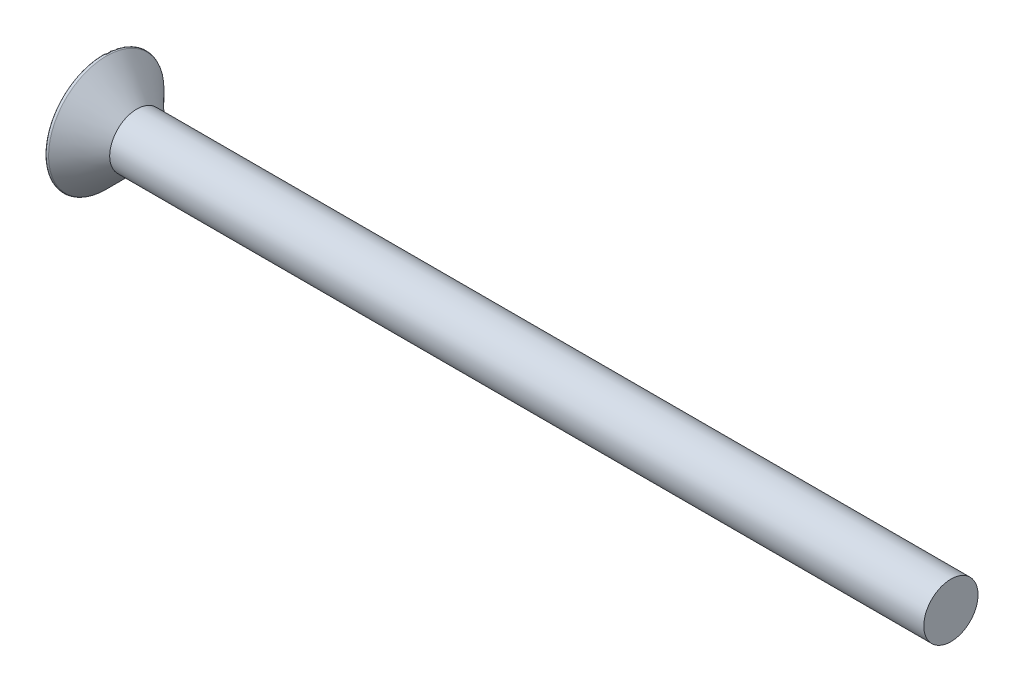
ISO-10303-21;
HEADER;
FILE_DESCRIPTION(('STEP AP214'),'2;1');
FILE_NAME('part.step','',(''),(''),'','','');
FILE_SCHEMA(('AUTOMOTIVE_DESIGN { 1 0 10303 214 1 1 1 1 }'));
ENDSEC;
DATA;
#1=APPLICATION_CONTEXT('core data for automotive mechanical design processes');
#2=APPLICATION_PROTOCOL_DEFINITION('international standard','automotive_design',2000,#1);
#3=PRODUCT_CONTEXT('',#1,'mechanical');
#4=PRODUCT('Part','Part','',(#3));
#5=PRODUCT_RELATED_PRODUCT_CATEGORY('part','',(#4));
#6=PRODUCT_DEFINITION_FORMATION('','',#4);
#7=PRODUCT_DEFINITION_CONTEXT('part definition',#1,'design');
#8=PRODUCT_DEFINITION('design','',#6,#7);
#9=PRODUCT_DEFINITION_SHAPE('','',#8);
#10=(LENGTH_UNIT() NAMED_UNIT(*) SI_UNIT(.MILLI.,.METRE.));
#11=(NAMED_UNIT(*) PLANE_ANGLE_UNIT() SI_UNIT($,.RADIAN.));
#12=(NAMED_UNIT(*) SI_UNIT($,.STERADIAN.) SOLID_ANGLE_UNIT());
#13=UNCERTAINTY_MEASURE_WITH_UNIT(LENGTH_MEASURE(1.E-05),#10,'distance_accuracy_value','');
#14=(GEOMETRIC_REPRESENTATION_CONTEXT(3) GLOBAL_UNCERTAINTY_ASSIGNED_CONTEXT((#13)) GLOBAL_UNIT_ASSIGNED_CONTEXT((#10,
#11,#12)) REPRESENTATION_CONTEXT('',''));
#15=CARTESIAN_POINT('',(0.,0.,0.));
#16=DIRECTION('',(0.,0.,1.));
#17=DIRECTION('',(1.,0.,0.));
#18=AXIS2_PLACEMENT_3D('',#15,#16,#17);
#19=CARTESIAN_POINT('',(0.,0.,0.));
#20=DIRECTION('',(1.,0.,0.));
#21=DIRECTION('',(0.,0.,-1.));
#22=AXIS2_PLACEMENT_3D('',#19,#20,#21);
#23=PLANE('',#22);
#24=CARTESIAN_POINT('',(0.,0.,0.));
#25=DIRECTION('',(1.,0.,0.));
#26=DIRECTION('',(0.,0.,-1.));
#27=AXIS2_PLACEMENT_3D('',#24,#25,#26);
#28=CIRCLE('',#27,3.11857864376269);
#29=CARTESIAN_POINT('',(0.,0.,-3.11857864376269));
#30=VERTEX_POINT('',#29);
#31=EDGE_CURVE('E40',#30,#30,#28,.F.);
#32=ORIENTED_EDGE('',*,*,#31,.T.);
#33=EDGE_LOOP('',(#32));
#34=FACE_BOUND('',#33,.T.);
#35=ADVANCED_FACE('F33',(#34),#23,.F.);
#36=CARTESIAN_POINT('',(1.86,0.,0.));
#37=DIRECTION('',(-1.,0.,0.));
#38=DIRECTION('',(0.,0.,1.));
#39=AXIS2_PLACEMENT_3D('',#36,#37,#38);
#40=CONICAL_SURFACE('',#39,1.49999999999999,0.78539816339745);
#41=CARTESIAN_POINT('',(0.170710678118655,0.,0.));
#42=DIRECTION('',(1.,0.,0.));
#43=DIRECTION('',(0.,0.,-1.));
#44=AXIS2_PLACEMENT_3D('',#41,#42,#43);
#45=CIRCLE('',#44,3.18928932188134);
#46=CARTESIAN_POINT('',(0.170710678118655,0.,-3.18928932188134));
#47=VERTEX_POINT('',#46);
#48=EDGE_CURVE('E10',#47,#47,#45,.T.);
#49=ORIENTED_EDGE('',*,*,#48,.T.);
#50=EDGE_LOOP('',(#49));
#51=FACE_BOUND('',#50,.T.);
#52=CARTESIAN_POINT('',(1.86,0.,0.));
#53=DIRECTION('',(-1.,0.,0.));
#54=DIRECTION('',(0.,0.,1.));
#55=AXIS2_PLACEMENT_3D('',#52,#53,#54);
#56=CIRCLE('',#55,1.49999999999999);
#57=CARTESIAN_POINT('',(1.86,0.,1.49999999999999));
#58=VERTEX_POINT('',#57);
#59=EDGE_CURVE('E44',#58,#58,#56,.T.);
#60=ORIENTED_EDGE('',*,*,#59,.T.);
#61=EDGE_LOOP('',(#60));
#62=FACE_BOUND('',#61,.T.);
#63=ADVANCED_FACE('F64',(#51,#62),#40,.T.);
#64=CARTESIAN_POINT('',(0.,0.,0.));
#65=DIRECTION('',(-1.,0.,0.));
#66=DIRECTION('',(0.,0.,1.));
#67=AXIS2_PLACEMENT_3D('',#64,#65,#66);
#68=CYLINDRICAL_SURFACE('',#67,1.49999999999999);
#69=ORIENTED_EDGE('',*,*,#59,.F.);
#70=EDGE_LOOP('',(#69));
#71=FACE_BOUND('',#70,.T.);
#72=CARTESIAN_POINT('',(46.86,0.,0.));
#73=DIRECTION('',(-1.,0.,0.));
#74=DIRECTION('',(0.,0.,1.));
#75=AXIS2_PLACEMENT_3D('',#72,#73,#74);
#76=CIRCLE('',#75,1.49999999999999);
#77=CARTESIAN_POINT('',(46.86,0.,1.49999999999999));
#78=VERTEX_POINT('',#77);
#79=EDGE_CURVE('E48',#78,#78,#76,.T.);
#80=ORIENTED_EDGE('',*,*,#79,.T.);
#81=EDGE_LOOP('',(#80));
#82=FACE_BOUND('',#81,.T.);
#83=ADVANCED_FACE('F54',(#71,#82),#68,.T.);
#84=CARTESIAN_POINT('',(46.86,1.49999999999999,0.));
#85=DIRECTION('',(-1.,0.,0.));
#86=DIRECTION('',(0.,0.,1.));
#87=AXIS2_PLACEMENT_3D('',#84,#85,#86);
#88=PLANE('',#87);
#89=ORIENTED_EDGE('',*,*,#79,.F.);
#90=EDGE_LOOP('',(#89));
#91=FACE_BOUND('',#90,.T.);
#92=ADVANCED_FACE('F56',(#91),#88,.F.);
#93=CARTESIAN_POINT('',(0.1,0.,0.));
#94=DIRECTION('',(1.,0.,0.));
#95=DIRECTION('',(0.,0.,-1.));
#96=AXIS2_PLACEMENT_3D('',#93,#94,#95);
#97=TOROIDAL_SURFACE('',#96,3.11857864376269,0.1);
#98=ORIENTED_EDGE('',*,*,#48,.F.);
#99=EDGE_LOOP('',(#98));
#100=FACE_BOUND('',#99,.T.);
#101=ORIENTED_EDGE('',*,*,#31,.F.);
#102=EDGE_LOOP('',(#101));
#103=FACE_BOUND('',#102,.T.);
#104=ADVANCED_FACE('F35',(#100,#103),#97,.T.);
#105=CLOSED_SHELL('',(#35,#63,#83,#92,#104));
#106=MANIFOLD_SOLID_BREP('B2',#105);
#107=ADVANCED_BREP_SHAPE_REPRESENTATION('',(#18,#106),#14);
#108=SHAPE_DEFINITION_REPRESENTATION(#9,#107);
ENDSEC;
END-ISO-10303-21;
